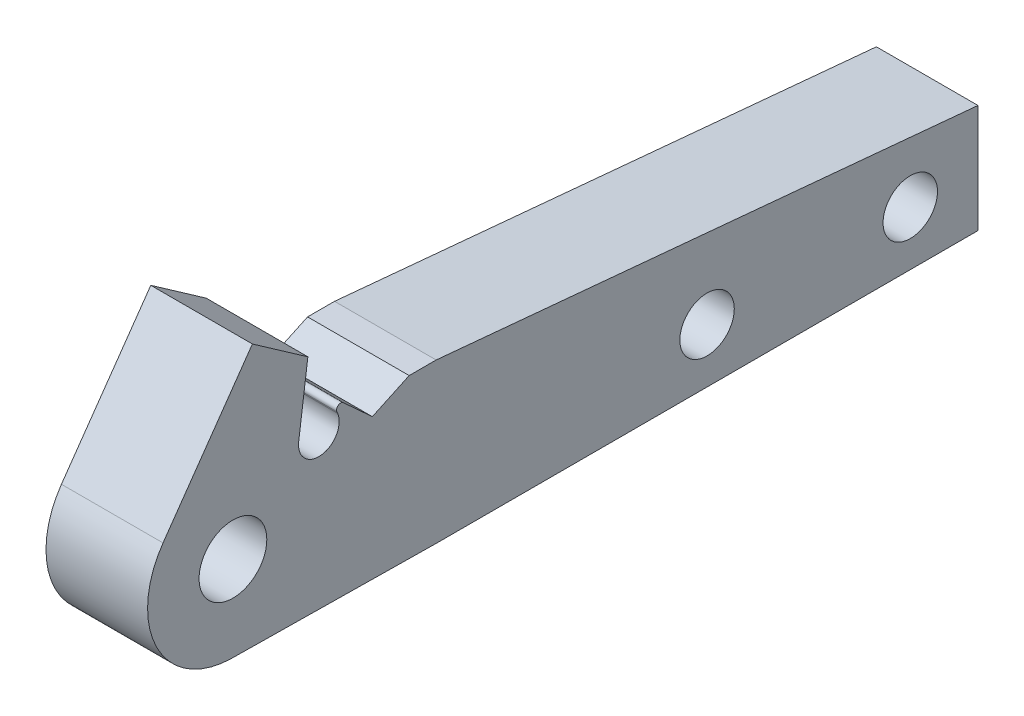
ISO-10303-21;
HEADER;
FILE_DESCRIPTION(('STEP AP214'),'2;1');
FILE_NAME('part.step','',(''),(''),'','','');
FILE_SCHEMA(('AUTOMOTIVE_DESIGN { 1 0 10303 214 1 1 1 1 }'));
ENDSEC;
DATA;
#1=APPLICATION_CONTEXT('core data for automotive mechanical design processes');
#2=APPLICATION_PROTOCOL_DEFINITION('international standard','automotive_design',2000,#1);
#3=PRODUCT_CONTEXT('',#1,'mechanical');
#4=PRODUCT('Part','Part','',(#3));
#5=PRODUCT_RELATED_PRODUCT_CATEGORY('part','',(#4));
#6=PRODUCT_DEFINITION_FORMATION('','',#4);
#7=PRODUCT_DEFINITION_CONTEXT('part definition',#1,'design');
#8=PRODUCT_DEFINITION('design','',#6,#7);
#9=PRODUCT_DEFINITION_SHAPE('','',#8);
#10=(LENGTH_UNIT() NAMED_UNIT(*) SI_UNIT(.MILLI.,.METRE.));
#11=(NAMED_UNIT(*) PLANE_ANGLE_UNIT() SI_UNIT($,.RADIAN.));
#12=(NAMED_UNIT(*) SI_UNIT($,.STERADIAN.) SOLID_ANGLE_UNIT());
#13=UNCERTAINTY_MEASURE_WITH_UNIT(LENGTH_MEASURE(1.E-05),#10,'distance_accuracy_value','');
#14=(GEOMETRIC_REPRESENTATION_CONTEXT(3) GLOBAL_UNCERTAINTY_ASSIGNED_CONTEXT((#13)) GLOBAL_UNIT_ASSIGNED_CONTEXT((#10,
#11,#12)) REPRESENTATION_CONTEXT('',''));
#15=CARTESIAN_POINT('',(0.,0.,0.));
#16=DIRECTION('',(0.,0.,1.));
#17=DIRECTION('',(1.,0.,0.));
#18=AXIS2_PLACEMENT_3D('',#15,#16,#17);
#19=CARTESIAN_POINT('',(6.35,9.525,-176.47164647412));
#20=DIRECTION('',(1.,0.,0.));
#21=DIRECTION('',(0.,0.,-1.));
#22=AXIS2_PLACEMENT_3D('',#19,#20,#21);
#23=PLANE('',#22);
#24=DIRECTION('',(0.,0.675997213115525,0.736904178207753));
#25=VECTOR('',#24,1.);
#26=CARTESIAN_POINT('',(6.35,14.5548502284291,-189.540378321137));
#27=LINE('',#26,#25);
#28=CARTESIAN_POINT('',(6.35,14.5548502284291,-189.540378321137));
#29=VERTEX_POINT('',#28);
#30=CARTESIAN_POINT('',(6.35,17.0473052344059,-186.823354534258));
#31=VERTEX_POINT('',#30);
#32=EDGE_CURVE('E183',#29,#31,#27,.T.);
#33=ORIENTED_EDGE('',*,*,#32,.T.);
#34=CARTESIAN_POINT('',(6.35,16.7665447425088,-186.565799596061));
#35=DIRECTION('',(1.,0.,0.));
#36=DIRECTION('',(0.,0.,-1.));
#37=AXIS2_PLACEMENT_3D('',#34,#35,#36);
#38=CIRCLE('',#37,0.381);
#39=CARTESIAN_POINT('',(6.35,16.6212011416768,-186.213611808514));
#40=VERTEX_POINT('',#39);
#41=EDGE_CURVE('E12',#31,#40,#38,.T.);
#42=ORIENTED_EDGE('',*,*,#41,.T.);
#43=DIRECTION('',(0.,-0.924377395136282,-0.381479267275513));
#44=VECTOR('',#43,1.);
#45=CARTESIAN_POINT('',(6.35,18.206999928397,-185.559172006775));
#46=LINE('',#45,#44);
#47=CARTESIAN_POINT('',(6.35,16.4460609906623,-186.285890010935));
#48=VERTEX_POINT('',#47);
#49=EDGE_CURVE('E185',#40,#48,#46,.T.);
#50=ORIENTED_EDGE('',*,*,#49,.T.);
#51=CARTESIAN_POINT('',(6.35,15.7193429865025,-184.524951073201));
#52=DIRECTION('',(-1.,0.,0.));
#53=DIRECTION('',(0.,0.,1.));
#54=AXIS2_PLACEMENT_3D('',#51,#52,#53);
#55=CIRCLE('',#54,1.905);
#56=CARTESIAN_POINT('',(6.35,15.9704562023799,-182.636574216529));
#57=VERTEX_POINT('',#56);
#58=EDGE_CURVE('E187',#48,#57,#55,.T.);
#59=ORIENTED_EDGE('',*,*,#58,.T.);
#60=DIRECTION('',(0.,0.991273940509862,-0.131817961090479));
#61=VECTOR('',#60,1.);
#62=CARTESIAN_POINT('',(6.35,15.9704562023799,-182.636574216529));
#63=LINE('',#62,#61);
#64=CARTESIAN_POINT('',(6.35,22.4356903032563,-183.496310301906));
#65=VERTEX_POINT('',#64);
#66=EDGE_CURVE('E189',#57,#65,#63,.T.);
#67=ORIENTED_EDGE('',*,*,#66,.T.);
#68=DIRECTION('',(0.,0.573576436351047,0.819152044288991));
#69=VECTOR('',#68,1.);
#70=CARTESIAN_POINT('',(6.35,26.0779006740854,-178.294694820671));
#71=LINE('',#70,#69);
#72=CARTESIAN_POINT('',(6.35,26.0779006740854,-178.294694820671));
#73=VERTEX_POINT('',#72);
#74=EDGE_CURVE('E191',#65,#73,#71,.T.);
#75=ORIENTED_EDGE('',*,*,#74,.T.);
#76=DIRECTION('',(0.,-0.819152044288991,0.573576436351048));
#77=VECTOR('',#76,1.);
#78=CARTESIAN_POINT('',(6.35,14.1141850672447,-169.917610967764));
#79=LINE('',#78,#77);
#80=CARTESIAN_POINT('',(6.35,14.1141850672447,-169.917610967764));
#81=VERTEX_POINT('',#80);
#82=EDGE_CURVE('E193',#73,#81,#79,.T.);
#83=ORIENTED_EDGE('',*,*,#82,.T.);
#84=CARTESIAN_POINT('',(6.35,9.525,-176.47164647412));
#85=DIRECTION('',(1.,0.,0.));
#86=DIRECTION('',(0.,0.,-1.));
#87=AXIS2_PLACEMENT_3D('',#84,#85,#86);
#88=CIRCLE('',#87,8.00100000000001);
#89=CARTESIAN_POINT('',(6.35,1.52470715135464,-176.365272906379));
#90=VERTEX_POINT('',#89);
#91=EDGE_CURVE('E169',#81,#90,#88,.T.);
#92=ORIENTED_EDGE('',*,*,#91,.T.);
#93=DIRECTION('',(0.,-0.0132950340883751,-0.999911617128528));
#94=VECTOR('',#93,1.);
#95=CARTESIAN_POINT('',(6.35,1.27000000001228,-195.521646474134));
#96=LINE('',#95,#94);
#97=CARTESIAN_POINT('',(6.35,1.27000000001228,-195.521646474134));
#98=VERTEX_POINT('',#97);
#99=EDGE_CURVE('E177',#90,#98,#96,.T.);
#100=ORIENTED_EDGE('',*,*,#99,.T.);
#101=DIRECTION('',(0.,0.,-1.));
#102=VECTOR('',#101,1.);
#103=CARTESIAN_POINT('',(6.35,1.27000000001228,-195.521646474134));
#104=LINE('',#103,#102);
#105=CARTESIAN_POINT('',(6.35,1.27000000001228,-246.321646474134));
#106=VERTEX_POINT('',#105);
#107=EDGE_CURVE('E255',#98,#106,#104,.T.);
#108=ORIENTED_EDGE('',*,*,#107,.T.);
#109=DIRECTION('',(0.,1.,0.));
#110=VECTOR('',#109,1.);
#111=CARTESIAN_POINT('',(6.35,1.27000000001228,-246.321646474134));
#112=LINE('',#111,#110);
#113=CARTESIAN_POINT('',(6.35,11.4300000000123,-246.321646474134));
#114=VERTEX_POINT('',#113);
#115=EDGE_CURVE('E257',#106,#114,#112,.T.);
#116=ORIENTED_EDGE('',*,*,#115,.T.);
#117=DIRECTION('',(0.,0.0928068904798706,0.995684127160546));
#118=VECTOR('',#117,1.);
#119=CARTESIAN_POINT('',(6.35,16.1650258056597,-195.52164647412));
#120=LINE('',#119,#118);
#121=CARTESIAN_POINT('',(6.35,16.1650258056597,-195.52164647412));
#122=VERTEX_POINT('',#121);
#123=EDGE_CURVE('E165',#114,#122,#120,.T.);
#124=ORIENTED_EDGE('',*,*,#123,.T.);
#125=DIRECTION('',(0.,4.5834151490827E-13,1.));
#126=VECTOR('',#125,1.);
#127=CARTESIAN_POINT('',(6.35,16.1650258056608,-192.993410989747));
#128=LINE('',#127,#126);
#129=CARTESIAN_POINT('',(6.35,16.1650258056608,-192.993410989747));
#130=VERTEX_POINT('',#129);
#131=EDGE_CURVE('E179',#122,#130,#128,.T.);
#132=ORIENTED_EDGE('',*,*,#131,.T.);
#133=DIRECTION('',(0.,-0.422618261740703,0.906307787036648));
#134=VECTOR('',#133,1.);
#135=CARTESIAN_POINT('',(6.35,14.8232128246341,-190.115883765906));
#136=LINE('',#135,#134);
#137=EDGE_CURVE('E181',#130,#29,#136,.T.);
#138=ORIENTED_EDGE('',*,*,#137,.T.);
#139=EDGE_LOOP('',(#33,#42,#50,#59,#67,#75,#83,#92,#100,#108,#116,#124,#132,#138));
#140=FACE_BOUND('',#139,.T.);
#141=CARTESIAN_POINT('',(6.35,9.525,-176.47164647412));
#142=DIRECTION('',(1.,0.,0.));
#143=DIRECTION('',(0.,0.,-1.));
#144=AXIS2_PLACEMENT_3D('',#141,#142,#143);
#145=CIRCLE('',#144,3.17499999999995);
#146=CARTESIAN_POINT('',(6.35,9.525,-179.64664647412));
#147=VERTEX_POINT('',#146);
#148=EDGE_CURVE('E166',#147,#147,#145,.T.);
#149=ORIENTED_EDGE('',*,*,#148,.F.);
#150=EDGE_LOOP('',(#149));
#151=FACE_BOUND('',#150,.T.);
#152=CARTESIAN_POINT('',(6.35,6.35000000001227,-239.971646474134));
#153=DIRECTION('',(1.,0.,0.));
#154=DIRECTION('',(0.,0.,-1.));
#155=AXIS2_PLACEMENT_3D('',#152,#153,#154);
#156=CIRCLE('',#155,2.55269999999998);
#157=CARTESIAN_POINT('',(6.35,6.35000000001227,-242.524346474134));
#158=VERTEX_POINT('',#157);
#159=EDGE_CURVE('E249',#158,#158,#156,.T.);
#160=ORIENTED_EDGE('',*,*,#159,.F.);
#161=EDGE_LOOP('',(#160));
#162=FACE_BOUND('',#161,.T.);
#163=CARTESIAN_POINT('',(6.35,6.35000000001227,-220.921646474134));
#164=DIRECTION('',(1.,0.,0.));
#165=DIRECTION('',(0.,0.,-1.));
#166=AXIS2_PLACEMENT_3D('',#163,#164,#165);
#167=CIRCLE('',#166,2.55269999999998);
#168=CARTESIAN_POINT('',(6.35,6.35000000001227,-223.474346474134));
#169=VERTEX_POINT('',#168);
#170=EDGE_CURVE('E252',#169,#169,#167,.T.);
#171=ORIENTED_EDGE('',*,*,#170,.F.);
#172=EDGE_LOOP('',(#171));
#173=FACE_BOUND('',#172,.T.);
#174=ADVANCED_FACE('F43',(#140,#151,#162,#173),#23,.T.);
#175=CARTESIAN_POINT('',(6.35,9.525,-176.47164647412));
#176=DIRECTION('',(-1.,0.,0.));
#177=DIRECTION('',(0.,0.,1.));
#178=AXIS2_PLACEMENT_3D('',#175,#176,#177);
#179=CYLINDRICAL_SURFACE('',#178,8.00100000000001);
#180=DIRECTION('',(-1.,0.,0.));
#181=VECTOR('',#180,1.);
#182=CARTESIAN_POINT('',(6.35,14.1141850672447,-169.917610967764));
#183=LINE('',#182,#181);
#184=CARTESIAN_POINT('',(-3.175,14.1141850672447,-169.917610967764));
#185=VERTEX_POINT('',#184);
#186=EDGE_CURVE('E195',#81,#185,#183,.T.);
#187=ORIENTED_EDGE('',*,*,#186,.T.);
#188=CARTESIAN_POINT('',(-3.175,9.525,-176.47164647412));
#189=DIRECTION('',(1.,0.,0.));
#190=DIRECTION('',(0.,0.,-1.));
#191=AXIS2_PLACEMENT_3D('',#188,#189,#190);
#192=CIRCLE('',#191,8.00100000000001);
#193=CARTESIAN_POINT('',(-3.175,1.52470715135464,-176.365272906379));
#194=VERTEX_POINT('',#193);
#195=EDGE_CURVE('E308',#185,#194,#192,.T.);
#196=ORIENTED_EDGE('',*,*,#195,.T.);
#197=DIRECTION('',(-1.,0.,0.));
#198=VECTOR('',#197,1.);
#199=CARTESIAN_POINT('',(6.35,1.52470715135464,-176.365272906379));
#200=LINE('',#199,#198);
#201=EDGE_CURVE('E221',#90,#194,#200,.T.);
#202=ORIENTED_EDGE('',*,*,#201,.F.);
#203=ORIENTED_EDGE('',*,*,#91,.F.);
#204=EDGE_LOOP('',(#187,#196,#202,#203));
#205=FACE_BOUND('',#204,.T.);
#206=ADVANCED_FACE('F295',(#205),#179,.T.);
#207=CARTESIAN_POINT('',(6.35,1.27000000001228,-195.521646474134));
#208=DIRECTION('',(0.,0.999911617128528,-0.0132950340883751));
#209=DIRECTION('',(0.,0.0132950340883751,0.999911617128528));
#210=AXIS2_PLACEMENT_3D('',#207,#208,#209);
#211=PLANE('',#210);
#212=ORIENTED_EDGE('',*,*,#201,.T.);
#213=DIRECTION('',(0.,-0.0132950340883751,-0.999911617128528));
#214=VECTOR('',#213,1.);
#215=CARTESIAN_POINT('',(-3.175,1.27000000001228,-195.521646474134));
#216=LINE('',#215,#214);
#217=CARTESIAN_POINT('',(-3.175,1.27000000001228,-195.521646474134));
#218=VERTEX_POINT('',#217);
#219=EDGE_CURVE('E301',#194,#218,#216,.T.);
#220=ORIENTED_EDGE('',*,*,#219,.T.);
#221=DIRECTION('',(-1.,0.,0.));
#222=VECTOR('',#221,1.);
#223=CARTESIAN_POINT('',(6.35,1.27000000001228,-195.521646474134));
#224=LINE('',#223,#222);
#225=EDGE_CURVE('E218',#98,#218,#224,.T.);
#226=ORIENTED_EDGE('',*,*,#225,.F.);
#227=ORIENTED_EDGE('',*,*,#99,.F.);
#228=EDGE_LOOP('',(#212,#220,#226,#227));
#229=FACE_BOUND('',#228,.T.);
#230=ADVANCED_FACE('F300',(#229),#211,.F.);
#231=CARTESIAN_POINT('',(6.35,16.1650258056608,-192.993410989747));
#232=DIRECTION('',(0.,-1.,4.5834151490827E-13));
#233=DIRECTION('',(0.,-4.5834151490827E-13,-1.));
#234=AXIS2_PLACEMENT_3D('',#231,#232,#233);
#235=PLANE('',#234);
#236=DIRECTION('',(-1.,0.,0.));
#237=VECTOR('',#236,1.);
#238=CARTESIAN_POINT('',(6.35,16.1650258056597,-195.52164647412));
#239=LINE('',#238,#237);
#240=CARTESIAN_POINT('',(-3.175,16.1650258056597,-195.52164647412));
#241=VERTEX_POINT('',#240);
#242=EDGE_CURVE('E216',#122,#241,#239,.T.);
#243=ORIENTED_EDGE('',*,*,#242,.T.);
#244=DIRECTION('',(0.,4.5834151490827E-13,1.));
#245=VECTOR('',#244,1.);
#246=CARTESIAN_POINT('',(-3.175,16.1650258056608,-192.993410989747));
#247=LINE('',#246,#245);
#248=CARTESIAN_POINT('',(-3.175,16.1650258056608,-192.993410989747));
#249=VERTEX_POINT('',#248);
#250=EDGE_CURVE('E59',#241,#249,#247,.T.);
#251=ORIENTED_EDGE('',*,*,#250,.T.);
#252=DIRECTION('',(-1.,0.,0.));
#253=VECTOR('',#252,1.);
#254=CARTESIAN_POINT('',(6.35,16.1650258056608,-192.993410989747));
#255=LINE('',#254,#253);
#256=EDGE_CURVE('E213',#130,#249,#255,.T.);
#257=ORIENTED_EDGE('',*,*,#256,.F.);
#258=ORIENTED_EDGE('',*,*,#131,.F.);
#259=EDGE_LOOP('',(#243,#251,#257,#258));
#260=FACE_BOUND('',#259,.T.);
#261=ADVANCED_FACE('F264',(#260),#235,.F.);
#262=CARTESIAN_POINT('',(6.35,14.5548502284291,-189.540378321137));
#263=DIRECTION('',(0.,-0.906307787036876,-0.422618261740214));
#264=DIRECTION('',(0.,0.422618261740214,-0.906307787036876));
#265=AXIS2_PLACEMENT_3D('',#262,#263,#264);
#266=PLANE('',#265);
#267=ORIENTED_EDGE('',*,*,#256,.T.);
#268=DIRECTION('',(0.,-0.422618261740214,0.906307787036876));
#269=VECTOR('',#268,1.);
#270=CARTESIAN_POINT('',(-3.175,14.5548502284291,-189.540378321137));
#271=LINE('',#270,#269);
#272=CARTESIAN_POINT('',(-3.175,14.5548502284291,-189.540378321137));
#273=VERTEX_POINT('',#272);
#274=EDGE_CURVE('E239',#249,#273,#271,.T.);
#275=ORIENTED_EDGE('',*,*,#274,.T.);
#276=DIRECTION('',(-1.,0.,0.));
#277=VECTOR('',#276,1.);
#278=CARTESIAN_POINT('',(6.35,14.5548502284291,-189.540378321137));
#279=LINE('',#278,#277);
#280=EDGE_CURVE('E210',#29,#273,#279,.T.);
#281=ORIENTED_EDGE('',*,*,#280,.F.);
#282=ORIENTED_EDGE('',*,*,#137,.F.);
#283=EDGE_LOOP('',(#267,#275,#281,#282));
#284=FACE_BOUND('',#283,.T.);
#285=ADVANCED_FACE('F266',(#284),#266,.F.);
#286=CARTESIAN_POINT('',(6.35,14.5548502284291,-189.540378321137));
#287=DIRECTION('',(0.,-0.736904178207753,0.675997213115525));
#288=DIRECTION('',(0.,-0.675997213115525,-0.736904178207753));
#289=AXIS2_PLACEMENT_3D('',#286,#287,#288);
#290=PLANE('',#289);
#291=ORIENTED_EDGE('',*,*,#280,.T.);
#292=DIRECTION('',(0.,0.675997213115525,0.736904178207753));
#293=VECTOR('',#292,1.);
#294=CARTESIAN_POINT('',(-3.175,14.5548502284291,-189.540378321137));
#295=LINE('',#294,#293);
#296=CARTESIAN_POINT('',(-3.175,17.0473052344059,-186.823354534258));
#297=VERTEX_POINT('',#296);
#298=EDGE_CURVE('E238',#273,#297,#295,.T.);
#299=ORIENTED_EDGE('',*,*,#298,.T.);
#300=DIRECTION('',(-1.,0.,0.));
#301=VECTOR('',#300,1.);
#302=CARTESIAN_POINT('',(6.35,17.0473052344059,-186.823354534258));
#303=LINE('',#302,#301);
#304=EDGE_CURVE('E52',#297,#31,#303,.F.);
#305=ORIENTED_EDGE('',*,*,#304,.T.);
#306=ORIENTED_EDGE('',*,*,#32,.F.);
#307=EDGE_LOOP('',(#291,#299,#305,#306));
#308=FACE_BOUND('',#307,.T.);
#309=ADVANCED_FACE('F267',(#308),#290,.F.);
#310=CARTESIAN_POINT('',(6.35,18.206999928397,-185.559172006775));
#311=DIRECTION('',(0.,0.381479267275513,-0.924377395136282));
#312=DIRECTION('',(0.,0.924377395136282,0.381479267275513));
#313=AXIS2_PLACEMENT_3D('',#310,#311,#312);
#314=PLANE('',#313);
#315=DIRECTION('',(-1.,0.,0.));
#316=VECTOR('',#315,1.);
#317=CARTESIAN_POINT('',(6.35,16.6212011416768,-186.213611808514));
#318=LINE('',#317,#316);
#319=CARTESIAN_POINT('',(-3.175,16.6212011416768,-186.213611808514));
#320=VERTEX_POINT('',#319);
#321=EDGE_CURVE('E224',#40,#320,#318,.T.);
#322=ORIENTED_EDGE('',*,*,#321,.T.);
#323=DIRECTION('',(0.,-0.924377395136282,-0.381479267275513));
#324=VECTOR('',#323,1.);
#325=CARTESIAN_POINT('',(-3.175,18.206999928397,-185.559172006775));
#326=LINE('',#325,#324);
#327=CARTESIAN_POINT('',(-3.175,16.4460609906623,-186.285890010935));
#328=VERTEX_POINT('',#327);
#329=EDGE_CURVE('E233',#320,#328,#326,.T.);
#330=ORIENTED_EDGE('',*,*,#329,.T.);
#331=DIRECTION('',(-1.,0.,0.));
#332=VECTOR('',#331,1.);
#333=CARTESIAN_POINT('',(6.35,16.4460609906623,-186.285890010935));
#334=LINE('',#333,#332);
#335=EDGE_CURVE('E207',#48,#328,#334,.T.);
#336=ORIENTED_EDGE('',*,*,#335,.F.);
#337=ORIENTED_EDGE('',*,*,#49,.F.);
#338=EDGE_LOOP('',(#322,#330,#336,#337));
#339=FACE_BOUND('',#338,.T.);
#340=ADVANCED_FACE('F231',(#339),#314,.F.);
#341=CARTESIAN_POINT('',(6.35,15.7193429865025,-184.524951073201));
#342=DIRECTION('',(-1.,0.,0.));
#343=DIRECTION('',(0.,0.,1.));
#344=AXIS2_PLACEMENT_3D('',#341,#342,#343);
#345=CYLINDRICAL_SURFACE('',#344,1.905);
#346=ORIENTED_EDGE('',*,*,#335,.T.);
#347=CARTESIAN_POINT('',(-3.175,15.7193429865025,-184.524951073201));
#348=DIRECTION('',(1.,0.,0.));
#349=DIRECTION('',(0.,0.,-1.));
#350=AXIS2_PLACEMENT_3D('',#347,#348,#349);
#351=CIRCLE('',#350,1.905);
#352=CARTESIAN_POINT('',(-3.175,15.9704562023799,-182.636574216529));
#353=VERTEX_POINT('',#352);
#354=EDGE_CURVE('E274',#328,#353,#351,.F.);
#355=ORIENTED_EDGE('',*,*,#354,.T.);
#356=DIRECTION('',(-1.,0.,0.));
#357=VECTOR('',#356,1.);
#358=CARTESIAN_POINT('',(6.35,15.9704562023799,-182.636574216529));
#359=LINE('',#358,#357);
#360=EDGE_CURVE('E204',#57,#353,#359,.T.);
#361=ORIENTED_EDGE('',*,*,#360,.F.);
#362=ORIENTED_EDGE('',*,*,#58,.F.);
#363=EDGE_LOOP('',(#346,#355,#361,#362));
#364=FACE_BOUND('',#363,.T.);
#365=ADVANCED_FACE('F272',(#364),#345,.F.);
#366=CARTESIAN_POINT('',(6.35,15.9704562023799,-182.636574216529));
#367=DIRECTION('',(0.,0.131817961090479,0.991273940509862));
#368=DIRECTION('',(0.,-0.991273940509862,0.131817961090479));
#369=AXIS2_PLACEMENT_3D('',#366,#367,#368);
#370=PLANE('',#369);
#371=ORIENTED_EDGE('',*,*,#360,.T.);
#372=DIRECTION('',(0.,0.991273940509862,-0.131817961090479));
#373=VECTOR('',#372,1.);
#374=CARTESIAN_POINT('',(-3.175,15.9704562023799,-182.636574216529));
#375=LINE('',#374,#373);
#376=CARTESIAN_POINT('',(-3.175,22.4356903032563,-183.496310301906));
#377=VERTEX_POINT('',#376);
#378=EDGE_CURVE('E312',#353,#377,#375,.T.);
#379=ORIENTED_EDGE('',*,*,#378,.T.);
#380=DIRECTION('',(-1.,0.,0.));
#381=VECTOR('',#380,1.);
#382=CARTESIAN_POINT('',(6.35,22.4356903032563,-183.496310301906));
#383=LINE('',#382,#381);
#384=EDGE_CURVE('E201',#65,#377,#383,.T.);
#385=ORIENTED_EDGE('',*,*,#384,.F.);
#386=ORIENTED_EDGE('',*,*,#66,.F.);
#387=EDGE_LOOP('',(#371,#379,#385,#386));
#388=FACE_BOUND('',#387,.T.);
#389=ADVANCED_FACE('F278',(#388),#370,.F.);
#390=CARTESIAN_POINT('',(6.35,26.0779006740854,-178.294694820671));
#391=DIRECTION('',(0.,-0.819152044288991,0.573576436351047));
#392=DIRECTION('',(0.,-0.573576436351047,-0.819152044288991));
#393=AXIS2_PLACEMENT_3D('',#390,#391,#392);
#394=PLANE('',#393);
#395=ORIENTED_EDGE('',*,*,#384,.T.);
#396=DIRECTION('',(0.,0.573576436351047,0.819152044288991));
#397=VECTOR('',#396,1.);
#398=CARTESIAN_POINT('',(-3.175,26.0779006740854,-178.294694820671));
#399=LINE('',#398,#397);
#400=CARTESIAN_POINT('',(-3.175,26.0779006740854,-178.294694820671));
#401=VERTEX_POINT('',#400);
#402=EDGE_CURVE('E286',#377,#401,#399,.T.);
#403=ORIENTED_EDGE('',*,*,#402,.T.);
#404=DIRECTION('',(-1.,0.,0.));
#405=VECTOR('',#404,1.);
#406=CARTESIAN_POINT('',(6.35,26.0779006740854,-178.294694820671));
#407=LINE('',#406,#405);
#408=EDGE_CURVE('E198',#73,#401,#407,.T.);
#409=ORIENTED_EDGE('',*,*,#408,.F.);
#410=ORIENTED_EDGE('',*,*,#74,.F.);
#411=EDGE_LOOP('',(#395,#403,#409,#410));
#412=FACE_BOUND('',#411,.T.);
#413=ADVANCED_FACE('F285',(#412),#394,.F.);
#414=CARTESIAN_POINT('',(6.35,14.1141850672447,-169.917610967764));
#415=DIRECTION('',(0.,-0.573576436351048,-0.819152044288991));
#416=DIRECTION('',(0.,0.819152044288991,-0.573576436351048));
#417=AXIS2_PLACEMENT_3D('',#414,#415,#416);
#418=PLANE('',#417);
#419=ORIENTED_EDGE('',*,*,#408,.T.);
#420=DIRECTION('',(0.,-0.819152044288991,0.573576436351048));
#421=VECTOR('',#420,1.);
#422=CARTESIAN_POINT('',(-3.175,14.1141850672447,-169.917610967764));
#423=LINE('',#422,#421);
#424=EDGE_CURVE('E291',#401,#185,#423,.T.);
#425=ORIENTED_EDGE('',*,*,#424,.T.);
#426=ORIENTED_EDGE('',*,*,#186,.F.);
#427=ORIENTED_EDGE('',*,*,#82,.F.);
#428=EDGE_LOOP('',(#419,#425,#426,#427));
#429=FACE_BOUND('',#428,.T.);
#430=ADVANCED_FACE('F289',(#429),#418,.F.);
#431=CARTESIAN_POINT('',(6.35,9.525,-176.47164647412));
#432=DIRECTION('',(-1.,0.,0.));
#433=DIRECTION('',(0.,0.,1.));
#434=AXIS2_PLACEMENT_3D('',#431,#432,#433);
#435=CYLINDRICAL_SURFACE('',#434,3.17499999999995);
#436=CARTESIAN_POINT('',(-3.175,9.525,-176.47164647412));
#437=DIRECTION('',(1.,0.,0.));
#438=DIRECTION('',(0.,0.,-1.));
#439=AXIS2_PLACEMENT_3D('',#436,#437,#438);
#440=CIRCLE('',#439,3.17499999999995);
#441=CARTESIAN_POINT('',(-3.175,9.525,-179.64664647412));
#442=VERTEX_POINT('',#441);
#443=EDGE_CURVE('E241',#442,#442,#440,.T.);
#444=ORIENTED_EDGE('',*,*,#443,.F.);
#445=EDGE_LOOP('',(#444));
#446=FACE_BOUND('',#445,.T.);
#447=ORIENTED_EDGE('',*,*,#148,.T.);
#448=EDGE_LOOP('',(#447));
#449=FACE_BOUND('',#448,.T.);
#450=ADVANCED_FACE('F340',(#446,#449),#435,.F.);
#451=CARTESIAN_POINT('',(6.35,16.7665447425088,-186.565799596061));
#452=DIRECTION('',(-1.,0.,0.));
#453=DIRECTION('',(0.,0.,1.));
#454=AXIS2_PLACEMENT_3D('',#451,#452,#453);
#455=CYLINDRICAL_SURFACE('',#454,0.381);
#456=CARTESIAN_POINT('',(-3.175,16.7665447425088,-186.565799596061));
#457=DIRECTION('',(1.,0.,0.));
#458=DIRECTION('',(0.,0.,-1.));
#459=AXIS2_PLACEMENT_3D('',#456,#457,#458);
#460=CIRCLE('',#459,0.381);
#461=EDGE_CURVE('E237',#320,#297,#460,.F.);
#462=ORIENTED_EDGE('',*,*,#461,.F.);
#463=ORIENTED_EDGE('',*,*,#321,.F.);
#464=ORIENTED_EDGE('',*,*,#41,.F.);
#465=ORIENTED_EDGE('',*,*,#304,.F.);
#466=EDGE_LOOP('',(#462,#463,#464,#465));
#467=FACE_BOUND('',#466,.T.);
#468=ADVANCED_FACE('F45',(#467),#455,.T.);
#469=CARTESIAN_POINT('',(-59.2886606720673,1.27000000001228,-195.521646474134));
#470=DIRECTION('',(0.,-1.,0.));
#471=DIRECTION('',(0.,0.,-1.));
#472=AXIS2_PLACEMENT_3D('',#469,#470,#471);
#473=PLANE('',#472);
#474=DIRECTION('',(0.,0.,1.));
#475=VECTOR('',#474,1.);
#476=CARTESIAN_POINT('',(-3.175,1.27000000001228,-195.521646474134));
#477=LINE('',#476,#475);
#478=CARTESIAN_POINT('',(-3.175,1.27000000001228,-246.321646474134));
#479=VERTEX_POINT('',#478);
#480=EDGE_CURVE('E160',#479,#218,#477,.T.);
#481=ORIENTED_EDGE('',*,*,#480,.F.);
#482=DIRECTION('',(1.,0.,0.));
#483=VECTOR('',#482,1.);
#484=CARTESIAN_POINT('',(-59.2886606720673,1.27000000001228,-246.321646474134));
#485=LINE('',#484,#483);
#486=EDGE_CURVE('E159',#479,#106,#485,.T.);
#487=ORIENTED_EDGE('',*,*,#486,.T.);
#488=ORIENTED_EDGE('',*,*,#107,.F.);
#489=ORIENTED_EDGE('',*,*,#225,.T.);
#490=EDGE_LOOP('',(#481,#487,#488,#489));
#491=FACE_BOUND('',#490,.T.);
#492=ADVANCED_FACE('F303',(#491),#473,.T.);
#493=CARTESIAN_POINT('',(-59.2886606720673,1.27000000001228,-246.321646474134));
#494=DIRECTION('',(0.,0.,-1.));
#495=DIRECTION('',(-1.,0.,0.));
#496=AXIS2_PLACEMENT_3D('',#493,#494,#495);
#497=PLANE('',#496);
#498=DIRECTION('',(0.,-1.,0.));
#499=VECTOR('',#498,1.);
#500=CARTESIAN_POINT('',(-3.175,1.27000000001228,-246.321646474134));
#501=LINE('',#500,#499);
#502=CARTESIAN_POINT('',(-3.175,11.4300000000123,-246.321646474134));
#503=VERTEX_POINT('',#502);
#504=EDGE_CURVE('E145',#503,#479,#501,.T.);
#505=ORIENTED_EDGE('',*,*,#504,.F.);
#506=DIRECTION('',(1.,0.,0.));
#507=VECTOR('',#506,1.);
#508=CARTESIAN_POINT('',(-59.2886606720673,11.4300000000123,-246.321646474134));
#509=LINE('',#508,#507);
#510=EDGE_CURVE('E157',#503,#114,#509,.T.);
#511=ORIENTED_EDGE('',*,*,#510,.T.);
#512=ORIENTED_EDGE('',*,*,#115,.F.);
#513=ORIENTED_EDGE('',*,*,#486,.F.);
#514=EDGE_LOOP('',(#505,#511,#512,#513));
#515=FACE_BOUND('',#514,.T.);
#516=ADVANCED_FACE('F155',(#515),#497,.T.);
#517=CARTESIAN_POINT('',(-59.2886606720673,16.1650258056597,-195.52164647412));
#518=DIRECTION('',(0.,0.995684127160545,-0.0928068904798706));
#519=DIRECTION('',(0.,0.0928068904798706,0.995684127160545));
#520=AXIS2_PLACEMENT_3D('',#517,#518,#519);
#521=PLANE('',#520);
#522=DIRECTION('',(0.,-0.0928068904798706,-0.995684127160545));
#523=VECTOR('',#522,1.);
#524=CARTESIAN_POINT('',(-3.175,16.1650258056597,-195.52164647412));
#525=LINE('',#524,#523);
#526=EDGE_CURVE('E142',#241,#503,#525,.T.);
#527=ORIENTED_EDGE('',*,*,#526,.F.);
#528=ORIENTED_EDGE('',*,*,#242,.F.);
#529=ORIENTED_EDGE('',*,*,#123,.F.);
#530=ORIENTED_EDGE('',*,*,#510,.F.);
#531=EDGE_LOOP('',(#527,#528,#529,#530));
#532=FACE_BOUND('',#531,.T.);
#533=ADVANCED_FACE('F163',(#532),#521,.T.);
#534=CARTESIAN_POINT('',(-59.2886606720673,6.35000000001227,-220.921646474134));
#535=DIRECTION('',(1.,0.,0.));
#536=DIRECTION('',(0.,0.,-1.));
#537=AXIS2_PLACEMENT_3D('',#534,#535,#536);
#538=CYLINDRICAL_SURFACE('',#537,2.55269999999998);
#539=CARTESIAN_POINT('',(-3.175,6.35000000001227,-220.921646474134));
#540=DIRECTION('',(1.,0.,0.));
#541=DIRECTION('',(0.,0.,-1.));
#542=AXIS2_PLACEMENT_3D('',#539,#540,#541);
#543=CIRCLE('',#542,2.55269999999998);
#544=CARTESIAN_POINT('',(-3.175,6.35000000001227,-223.474346474134));
#545=VERTEX_POINT('',#544);
#546=EDGE_CURVE('E151',#545,#545,#543,.F.);
#547=ORIENTED_EDGE('',*,*,#546,.T.);
#548=EDGE_LOOP('',(#547));
#549=FACE_BOUND('',#548,.T.);
#550=ORIENTED_EDGE('',*,*,#170,.T.);
#551=EDGE_LOOP('',(#550));
#552=FACE_BOUND('',#551,.T.);
#553=ADVANCED_FACE('F330',(#549,#552),#538,.F.);
#554=CARTESIAN_POINT('',(-59.2886606720673,6.35000000001227,-239.971646474134));
#555=DIRECTION('',(1.,0.,0.));
#556=DIRECTION('',(0.,0.,-1.));
#557=AXIS2_PLACEMENT_3D('',#554,#555,#556);
#558=CYLINDRICAL_SURFACE('',#557,2.55269999999998);
#559=CARTESIAN_POINT('',(-3.175,6.35000000001227,-239.971646474134));
#560=DIRECTION('',(1.,0.,0.));
#561=DIRECTION('',(0.,0.,-1.));
#562=AXIS2_PLACEMENT_3D('',#559,#560,#561);
#563=CIRCLE('',#562,2.55269999999998);
#564=CARTESIAN_POINT('',(-3.175,6.35000000001227,-242.524346474134));
#565=VERTEX_POINT('',#564);
#566=EDGE_CURVE('E47',#565,#565,#563,.F.);
#567=ORIENTED_EDGE('',*,*,#566,.T.);
#568=EDGE_LOOP('',(#567));
#569=FACE_BOUND('',#568,.T.);
#570=ORIENTED_EDGE('',*,*,#159,.T.);
#571=EDGE_LOOP('',(#570));
#572=FACE_BOUND('',#571,.T.);
#573=ADVANCED_FACE('F321',(#569,#572),#558,.F.);
#574=CARTESIAN_POINT('',(-3.175,9.525,-176.47164647412));
#575=DIRECTION('',(1.,0.,0.));
#576=DIRECTION('',(0.,0.,-1.));
#577=AXIS2_PLACEMENT_3D('',#574,#575,#576);
#578=PLANE('',#577);
#579=ORIENTED_EDGE('',*,*,#443,.T.);
#580=EDGE_LOOP('',(#579));
#581=FACE_BOUND('',#580,.T.);
#582=ORIENTED_EDGE('',*,*,#546,.F.);
#583=EDGE_LOOP('',(#582));
#584=FACE_BOUND('',#583,.T.);
#585=ORIENTED_EDGE('',*,*,#566,.F.);
#586=EDGE_LOOP('',(#585));
#587=FACE_BOUND('',#586,.T.);
#588=ORIENTED_EDGE('',*,*,#274,.F.);
#589=ORIENTED_EDGE('',*,*,#250,.F.);
#590=ORIENTED_EDGE('',*,*,#526,.T.);
#591=ORIENTED_EDGE('',*,*,#504,.T.);
#592=ORIENTED_EDGE('',*,*,#480,.T.);
#593=ORIENTED_EDGE('',*,*,#219,.F.);
#594=ORIENTED_EDGE('',*,*,#195,.F.);
#595=ORIENTED_EDGE('',*,*,#424,.F.);
#596=ORIENTED_EDGE('',*,*,#402,.F.);
#597=ORIENTED_EDGE('',*,*,#378,.F.);
#598=ORIENTED_EDGE('',*,*,#354,.F.);
#599=ORIENTED_EDGE('',*,*,#329,.F.);
#600=ORIENTED_EDGE('',*,*,#461,.T.);
#601=ORIENTED_EDGE('',*,*,#298,.F.);
#602=EDGE_LOOP('',(#588,#589,#590,#591,#592,#593,#594,#595,#596,#597,#598,#599,#600,#601));
#603=FACE_BOUND('',#602,.T.);
#604=ADVANCED_FACE('F144',(#581,#584,#587,#603),#578,.F.);
#605=CLOSED_SHELL('',(#174,#206,#230,#261,#285,#309,#340,#365,#389,#413,#430,#450,#468,#492,
#516,#533,#553,#573,#604));
#606=MANIFOLD_SOLID_BREP('B2',#605);
#607=ADVANCED_BREP_SHAPE_REPRESENTATION('',(#18,#606),#14);
#608=SHAPE_DEFINITION_REPRESENTATION(#9,#607);
ENDSEC;
END-ISO-10303-21;
